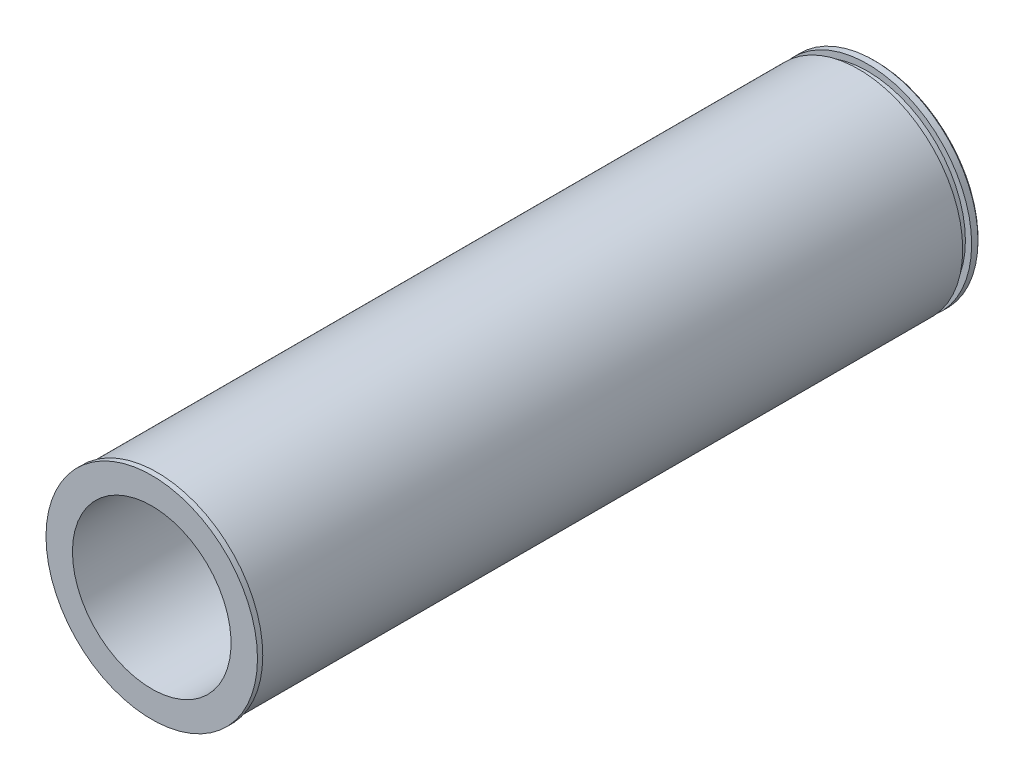
ISO-10303-21;
HEADER;
FILE_DESCRIPTION(('STEP AP214'),'2;1');
FILE_NAME('part.step','',(''),(''),'','','');
FILE_SCHEMA(('AUTOMOTIVE_DESIGN { 1 0 10303 214 1 1 1 1 }'));
ENDSEC;
DATA;
#1=APPLICATION_CONTEXT('core data for automotive mechanical design processes');
#2=APPLICATION_PROTOCOL_DEFINITION('international standard','automotive_design',2000,#1);
#3=PRODUCT_CONTEXT('',#1,'mechanical');
#4=PRODUCT('Part','Part','',(#3));
#5=PRODUCT_RELATED_PRODUCT_CATEGORY('part','',(#4));
#6=PRODUCT_DEFINITION_FORMATION('','',#4);
#7=PRODUCT_DEFINITION_CONTEXT('part definition',#1,'design');
#8=PRODUCT_DEFINITION('design','',#6,#7);
#9=PRODUCT_DEFINITION_SHAPE('','',#8);
#10=(LENGTH_UNIT() NAMED_UNIT(*) SI_UNIT(.MILLI.,.METRE.));
#11=(NAMED_UNIT(*) PLANE_ANGLE_UNIT() SI_UNIT($,.RADIAN.));
#12=(NAMED_UNIT(*) SI_UNIT($,.STERADIAN.) SOLID_ANGLE_UNIT());
#13=UNCERTAINTY_MEASURE_WITH_UNIT(LENGTH_MEASURE(1.E-05),#10,'distance_accuracy_value','');
#14=(GEOMETRIC_REPRESENTATION_CONTEXT(3) GLOBAL_UNCERTAINTY_ASSIGNED_CONTEXT((#13)) GLOBAL_UNIT_ASSIGNED_CONTEXT((#10,
#11,#12)) REPRESENTATION_CONTEXT('',''));
#15=CARTESIAN_POINT('',(0.,0.,0.));
#16=DIRECTION('',(0.,0.,1.));
#17=DIRECTION('',(1.,0.,0.));
#18=AXIS2_PLACEMENT_3D('',#15,#16,#17);
#19=CARTESIAN_POINT('',(0.,0.,0.));
#20=DIRECTION('',(0.,0.,-1.));
#21=DIRECTION('',(-1.,0.,0.));
#22=AXIS2_PLACEMENT_3D('',#19,#20,#21);
#23=CYLINDRICAL_SURFACE('',#22,23.5);
#24=CARTESIAN_POINT('',(0.,0.,-84.2645));
#25=DIRECTION('',(0.,0.,-1.));
#26=DIRECTION('',(-1.,0.,0.));
#27=AXIS2_PLACEMENT_3D('',#24,#25,#26);
#28=CIRCLE('',#27,23.5);
#29=CARTESIAN_POINT('',(-23.5,0.,-84.2645));
#30=VERTEX_POINT('',#29);
#31=EDGE_CURVE('E43',#30,#30,#28,.T.);
#32=ORIENTED_EDGE('',*,*,#31,.T.);
#33=EDGE_LOOP('',(#32));
#34=FACE_BOUND('',#33,.T.);
#35=CARTESIAN_POINT('',(0.,0.,-86.4145));
#36=DIRECTION('',(0.,0.,-1.));
#37=DIRECTION('',(-1.,0.,0.));
#38=AXIS2_PLACEMENT_3D('',#35,#36,#37);
#39=CIRCLE('',#38,23.5);
#40=CARTESIAN_POINT('',(-23.5,0.,-86.4145));
#41=VERTEX_POINT('',#40);
#42=EDGE_CURVE('E70',#41,#41,#39,.T.);
#43=ORIENTED_EDGE('',*,*,#42,.F.);
#44=EDGE_LOOP('',(#43));
#45=FACE_BOUND('',#44,.T.);
#46=ADVANCED_FACE('F32',(#34,#45),#23,.T.);
#47=CARTESIAN_POINT('',(0.,23.5,-84.2645));
#48=DIRECTION('',(0.,0.,-1.));
#49=DIRECTION('',(-1.,0.,0.));
#50=AXIS2_PLACEMENT_3D('',#47,#48,#49);
#51=PLANE('',#50);
#52=CARTESIAN_POINT('',(0.,0.,-84.2645));
#53=DIRECTION('',(0.,0.,-1.));
#54=DIRECTION('',(-1.,0.,0.));
#55=AXIS2_PLACEMENT_3D('',#52,#53,#54);
#56=CIRCLE('',#55,25.);
#57=CARTESIAN_POINT('',(-25.,0.,-84.2645));
#58=VERTEX_POINT('',#57);
#59=EDGE_CURVE('E47',#58,#58,#56,.T.);
#60=ORIENTED_EDGE('',*,*,#59,.T.);
#61=EDGE_LOOP('',(#60));
#62=FACE_BOUND('',#61,.T.);
#63=ORIENTED_EDGE('',*,*,#31,.F.);
#64=EDGE_LOOP('',(#63));
#65=FACE_BOUND('',#64,.T.);
#66=ADVANCED_FACE('F78',(#62,#65),#51,.T.);
#67=CARTESIAN_POINT('',(0.,0.,0.));
#68=DIRECTION('',(0.,0.,-1.));
#69=DIRECTION('',(-1.,0.,0.));
#70=AXIS2_PLACEMENT_3D('',#67,#68,#69);
#71=CYLINDRICAL_SURFACE('',#70,25.);
#72=CARTESIAN_POINT('',(0.,0.,84.2645));
#73=DIRECTION('',(0.,0.,-1.));
#74=DIRECTION('',(-1.,0.,0.));
#75=AXIS2_PLACEMENT_3D('',#72,#73,#74);
#76=CIRCLE('',#75,25.);
#77=CARTESIAN_POINT('',(-25.,0.,84.2645));
#78=VERTEX_POINT('',#77);
#79=EDGE_CURVE('E52',#78,#78,#76,.T.);
#80=ORIENTED_EDGE('',*,*,#79,.T.);
#81=EDGE_LOOP('',(#80));
#82=FACE_BOUND('',#81,.T.);
#83=ORIENTED_EDGE('',*,*,#59,.F.);
#84=EDGE_LOOP('',(#83));
#85=FACE_BOUND('',#84,.T.);
#86=ADVANCED_FACE('F83',(#82,#85),#71,.T.);
#87=CARTESIAN_POINT('',(0.,25.4,84.2645));
#88=DIRECTION('',(0.,0.,-1.));
#89=DIRECTION('',(-1.,0.,0.));
#90=AXIS2_PLACEMENT_3D('',#87,#88,#89);
#91=PLANE('',#90);
#92=CARTESIAN_POINT('',(0.,0.,84.2645));
#93=DIRECTION('',(0.,0.,-1.));
#94=DIRECTION('',(-1.,0.,0.));
#95=AXIS2_PLACEMENT_3D('',#92,#93,#94);
#96=CIRCLE('',#95,25.4);
#97=CARTESIAN_POINT('',(-25.4,0.,84.2645));
#98=VERTEX_POINT('',#97);
#99=EDGE_CURVE('E55',#98,#98,#96,.T.);
#100=ORIENTED_EDGE('',*,*,#99,.T.);
#101=EDGE_LOOP('',(#100));
#102=FACE_BOUND('',#101,.T.);
#103=ORIENTED_EDGE('',*,*,#79,.F.);
#104=EDGE_LOOP('',(#103));
#105=FACE_BOUND('',#104,.T.);
#106=ADVANCED_FACE('F89',(#102,#105),#91,.T.);
#107=CARTESIAN_POINT('',(0.,0.,0.));
#108=DIRECTION('',(0.,0.,-1.));
#109=DIRECTION('',(-1.,0.,0.));
#110=AXIS2_PLACEMENT_3D('',#107,#108,#109);
#111=CYLINDRICAL_SURFACE('',#110,25.4);
#112=CARTESIAN_POINT('',(0.,0.,85.5345));
#113=DIRECTION('',(0.,0.,-1.));
#114=DIRECTION('',(-1.,0.,0.));
#115=AXIS2_PLACEMENT_3D('',#112,#113,#114);
#116=CIRCLE('',#115,25.4);
#117=CARTESIAN_POINT('',(-25.4,0.,85.5345));
#118=VERTEX_POINT('',#117);
#119=EDGE_CURVE('E58',#118,#118,#116,.T.);
#120=ORIENTED_EDGE('',*,*,#119,.T.);
#121=EDGE_LOOP('',(#120));
#122=FACE_BOUND('',#121,.T.);
#123=ORIENTED_EDGE('',*,*,#99,.F.);
#124=EDGE_LOOP('',(#123));
#125=FACE_BOUND('',#124,.T.);
#126=ADVANCED_FACE('F93',(#122,#125),#111,.T.);
#127=CARTESIAN_POINT('',(0.,19.05,85.5345));
#128=DIRECTION('',(0.,0.,1.));
#129=DIRECTION('',(1.,0.,0.));
#130=AXIS2_PLACEMENT_3D('',#127,#128,#129);
#131=PLANE('',#130);
#132=CARTESIAN_POINT('',(0.,0.,85.5345));
#133=DIRECTION('',(0.,0.,-1.));
#134=DIRECTION('',(-1.,0.,0.));
#135=AXIS2_PLACEMENT_3D('',#132,#133,#134);
#136=CIRCLE('',#135,19.05);
#137=CARTESIAN_POINT('',(-19.05,0.,85.5345));
#138=VERTEX_POINT('',#137);
#139=EDGE_CURVE('E61',#138,#138,#136,.T.);
#140=ORIENTED_EDGE('',*,*,#139,.T.);
#141=EDGE_LOOP('',(#140));
#142=FACE_BOUND('',#141,.T.);
#143=ORIENTED_EDGE('',*,*,#119,.F.);
#144=EDGE_LOOP('',(#143));
#145=FACE_BOUND('',#144,.T.);
#146=ADVANCED_FACE('F97',(#142,#145),#131,.T.);
#147=CARTESIAN_POINT('',(0.,0.,0.));
#148=DIRECTION('',(0.,0.,-1.));
#149=DIRECTION('',(-1.,0.,0.));
#150=AXIS2_PLACEMENT_3D('',#147,#148,#149);
#151=CYLINDRICAL_SURFACE('',#150,19.05);
#152=CARTESIAN_POINT('',(0.,0.,-88.4465));
#153=DIRECTION('',(0.,0.,-1.));
#154=DIRECTION('',(-1.,0.,0.));
#155=AXIS2_PLACEMENT_3D('',#152,#153,#154);
#156=CIRCLE('',#155,19.05);
#157=CARTESIAN_POINT('',(-19.05,0.,-88.4465));
#158=VERTEX_POINT('',#157);
#159=EDGE_CURVE('E64',#158,#158,#156,.T.);
#160=ORIENTED_EDGE('',*,*,#159,.T.);
#161=EDGE_LOOP('',(#160));
#162=FACE_BOUND('',#161,.T.);
#163=ORIENTED_EDGE('',*,*,#139,.F.);
#164=EDGE_LOOP('',(#163));
#165=FACE_BOUND('',#164,.T.);
#166=ADVANCED_FACE('F101',(#162,#165),#151,.F.);
#167=CARTESIAN_POINT('',(0.,25.,-88.4465));
#168=DIRECTION('',(0.,0.,-1.));
#169=DIRECTION('',(-1.,0.,0.));
#170=AXIS2_PLACEMENT_3D('',#167,#168,#169);
#171=PLANE('',#170);
#172=CARTESIAN_POINT('',(0.,0.,-88.4465));
#173=DIRECTION('',(0.,0.,-1.));
#174=DIRECTION('',(-1.,0.,0.));
#175=AXIS2_PLACEMENT_3D('',#172,#173,#174);
#176=CIRCLE('',#175,24.492);
#177=CARTESIAN_POINT('',(-24.492,0.,-88.4465));
#178=VERTEX_POINT('',#177);
#179=EDGE_CURVE('E39',#178,#178,#176,.T.);
#180=ORIENTED_EDGE('',*,*,#179,.T.);
#181=EDGE_LOOP('',(#180));
#182=FACE_BOUND('',#181,.T.);
#183=ORIENTED_EDGE('',*,*,#159,.F.);
#184=EDGE_LOOP('',(#183));
#185=FACE_BOUND('',#184,.T.);
#186=ADVANCED_FACE('F105',(#182,#185),#171,.T.);
#187=CARTESIAN_POINT('',(0.,0.,0.));
#188=DIRECTION('',(0.,0.,-1.));
#189=DIRECTION('',(-1.,0.,0.));
#190=AXIS2_PLACEMENT_3D('',#187,#188,#189);
#191=CYLINDRICAL_SURFACE('',#190,25.);
#192=CARTESIAN_POINT('',(0.,0.,-87.9385));
#193=DIRECTION('',(0.,0.,-1.));
#194=DIRECTION('',(-1.,0.,0.));
#195=AXIS2_PLACEMENT_3D('',#192,#193,#194);
#196=CIRCLE('',#195,25.);
#197=CARTESIAN_POINT('',(-25.,0.,-87.9385));
#198=VERTEX_POINT('',#197);
#199=EDGE_CURVE('E10',#198,#198,#196,.F.);
#200=ORIENTED_EDGE('',*,*,#199,.T.);
#201=EDGE_LOOP('',(#200));
#202=FACE_BOUND('',#201,.T.);
#203=CARTESIAN_POINT('',(0.,0.,-86.4145));
#204=DIRECTION('',(0.,0.,-1.));
#205=DIRECTION('',(-1.,0.,0.));
#206=AXIS2_PLACEMENT_3D('',#203,#204,#205);
#207=CIRCLE('',#206,25.);
#208=CARTESIAN_POINT('',(-25.,0.,-86.4145));
#209=VERTEX_POINT('',#208);
#210=EDGE_CURVE('E67',#209,#209,#207,.T.);
#211=ORIENTED_EDGE('',*,*,#210,.T.);
#212=EDGE_LOOP('',(#211));
#213=FACE_BOUND('',#212,.T.);
#214=ADVANCED_FACE('F109',(#202,#213),#191,.T.);
#215=CARTESIAN_POINT('',(0.,23.5,-86.4145));
#216=DIRECTION('',(0.,0.,1.));
#217=DIRECTION('',(1.,0.,0.));
#218=AXIS2_PLACEMENT_3D('',#215,#216,#217);
#219=PLANE('',#218);
#220=ORIENTED_EDGE('',*,*,#42,.T.);
#221=EDGE_LOOP('',(#220));
#222=FACE_BOUND('',#221,.T.);
#223=ORIENTED_EDGE('',*,*,#210,.F.);
#224=EDGE_LOOP('',(#223));
#225=FACE_BOUND('',#224,.T.);
#226=ADVANCED_FACE('F74',(#222,#225),#219,.T.);
#227=CARTESIAN_POINT('',(0.,0.,-88.4465));
#228=DIRECTION('',(0.,0.,1.));
#229=DIRECTION('',(1.,0.,0.));
#230=AXIS2_PLACEMENT_3D('',#227,#228,#229);
#231=CONICAL_SURFACE('',#230,24.492,0.785398163397442);
#232=ORIENTED_EDGE('',*,*,#199,.F.);
#233=EDGE_LOOP('',(#232));
#234=FACE_BOUND('',#233,.T.);
#235=ORIENTED_EDGE('',*,*,#179,.F.);
#236=EDGE_LOOP('',(#235));
#237=FACE_BOUND('',#236,.T.);
#238=ADVANCED_FACE('F34',(#234,#237),#231,.T.);
#239=CLOSED_SHELL('',(#46,#66,#86,#106,#126,#146,#166,#186,#214,#226,#238));
#240=MANIFOLD_SOLID_BREP('B2',#239);
#241=ADVANCED_BREP_SHAPE_REPRESENTATION('',(#18,#240),#14);
#242=SHAPE_DEFINITION_REPRESENTATION(#9,#241);
ENDSEC;
END-ISO-10303-21;
